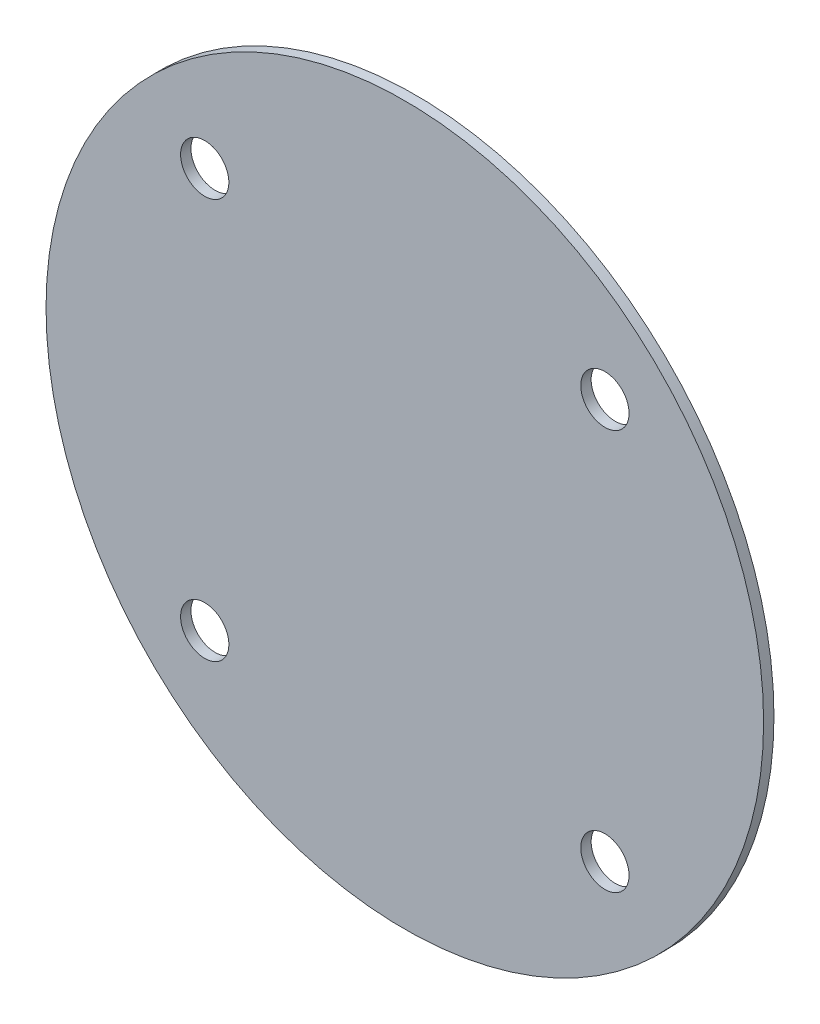
ISO-10303-21;
HEADER;
FILE_DESCRIPTION(('STEP AP214'),'2;1');
FILE_NAME('part.step','',(''),(''),'','','');
FILE_SCHEMA(('AUTOMOTIVE_DESIGN { 1 0 10303 214 1 1 1 1 }'));
ENDSEC;
DATA;
#1=APPLICATION_CONTEXT('core data for automotive mechanical design processes');
#2=APPLICATION_PROTOCOL_DEFINITION('international standard','automotive_design',2000,#1);
#3=PRODUCT_CONTEXT('',#1,'mechanical');
#4=PRODUCT('Part','Part','',(#3));
#5=PRODUCT_RELATED_PRODUCT_CATEGORY('part','',(#4));
#6=PRODUCT_DEFINITION_FORMATION('','',#4);
#7=PRODUCT_DEFINITION_CONTEXT('part definition',#1,'design');
#8=PRODUCT_DEFINITION('design','',#6,#7);
#9=PRODUCT_DEFINITION_SHAPE('','',#8);
#10=(LENGTH_UNIT() NAMED_UNIT(*) SI_UNIT(.MILLI.,.METRE.));
#11=(NAMED_UNIT(*) PLANE_ANGLE_UNIT() SI_UNIT($,.RADIAN.));
#12=(NAMED_UNIT(*) SI_UNIT($,.STERADIAN.) SOLID_ANGLE_UNIT());
#13=UNCERTAINTY_MEASURE_WITH_UNIT(LENGTH_MEASURE(1.E-05),#10,'distance_accuracy_value','');
#14=(GEOMETRIC_REPRESENTATION_CONTEXT(3) GLOBAL_UNCERTAINTY_ASSIGNED_CONTEXT((#13)) GLOBAL_UNIT_ASSIGNED_CONTEXT((#10,
#11,#12)) REPRESENTATION_CONTEXT('',''));
#15=CARTESIAN_POINT('',(0.,0.,0.));
#16=DIRECTION('',(0.,0.,1.));
#17=DIRECTION('',(1.,0.,0.));
#18=AXIS2_PLACEMENT_3D('',#15,#16,#17);
#19=CARTESIAN_POINT('',(29.,29.,17.));
#20=DIRECTION('',(0.,0.,1.));
#21=DIRECTION('',(1.,0.,0.));
#22=AXIS2_PLACEMENT_3D('',#19,#20,#21);
#23=CYLINDRICAL_SURFACE('',#22,3.5);
#24=DIRECTION('',(0.,0.,1.));
#25=VECTOR('',#24,1.);
#26=CARTESIAN_POINT('',(32.5,29.,17.));
#27=LINE('',#26,#25);
#28=CARTESIAN_POINT('',(32.5,29.,18.));
#29=VERTEX_POINT('',#28);
#30=CARTESIAN_POINT('',(32.5,29.,19.5));
#31=VERTEX_POINT('',#30);
#32=EDGE_CURVE('E10',#29,#31,#27,.T.);
#33=ORIENTED_EDGE('',*,*,#32,.F.);
#34=CARTESIAN_POINT('',(29.,29.,18.));
#35=DIRECTION('',(0.,0.,1.));
#36=DIRECTION('',(1.,0.,0.));
#37=AXIS2_PLACEMENT_3D('',#34,#35,#36);
#38=CIRCLE('',#37,3.5);
#39=EDGE_CURVE('E110',#29,#29,#38,.T.);
#40=ORIENTED_EDGE('',*,*,#39,.F.);
#41=ORIENTED_EDGE('',*,*,#32,.T.);
#42=CARTESIAN_POINT('',(29.,29.,19.5));
#43=DIRECTION('',(0.,0.,1.));
#44=DIRECTION('',(1.,0.,0.));
#45=AXIS2_PLACEMENT_3D('',#42,#43,#44);
#46=CIRCLE('',#45,3.5);
#47=EDGE_CURVE('E99',#31,#31,#46,.T.);
#48=ORIENTED_EDGE('',*,*,#47,.T.);
#49=EDGE_LOOP('',(#33,#40,#41,#48));
#50=FACE_BOUND('',#49,.T.);
#51=ADVANCED_FACE('F16',(#50),#23,.F.);
#52=CARTESIAN_POINT('',(-29.,29.,17.));
#53=DIRECTION('',(0.,0.,1.));
#54=DIRECTION('',(1.,0.,0.));
#55=AXIS2_PLACEMENT_3D('',#52,#53,#54);
#56=CYLINDRICAL_SURFACE('',#55,3.5);
#57=DIRECTION('',(0.,0.,1.));
#58=VECTOR('',#57,1.);
#59=CARTESIAN_POINT('',(-25.5,29.,17.));
#60=LINE('',#59,#58);
#61=CARTESIAN_POINT('',(-25.5,29.,18.));
#62=VERTEX_POINT('',#61);
#63=CARTESIAN_POINT('',(-25.5,29.,19.5));
#64=VERTEX_POINT('',#63);
#65=EDGE_CURVE('E27',#62,#64,#60,.T.);
#66=ORIENTED_EDGE('',*,*,#65,.F.);
#67=CARTESIAN_POINT('',(-29.,29.,18.));
#68=DIRECTION('',(0.,0.,1.));
#69=DIRECTION('',(1.,0.,0.));
#70=AXIS2_PLACEMENT_3D('',#67,#68,#69);
#71=CIRCLE('',#70,3.5);
#72=EDGE_CURVE('E78',#62,#62,#71,.T.);
#73=ORIENTED_EDGE('',*,*,#72,.F.);
#74=ORIENTED_EDGE('',*,*,#65,.T.);
#75=CARTESIAN_POINT('',(-29.,29.,19.5));
#76=DIRECTION('',(0.,0.,1.));
#77=DIRECTION('',(1.,0.,0.));
#78=AXIS2_PLACEMENT_3D('',#75,#76,#77);
#79=CIRCLE('',#78,3.5);
#80=EDGE_CURVE('E76',#64,#64,#79,.T.);
#81=ORIENTED_EDGE('',*,*,#80,.T.);
#82=EDGE_LOOP('',(#66,#73,#74,#81));
#83=FACE_BOUND('',#82,.T.);
#84=ADVANCED_FACE('F74',(#83),#56,.F.);
#85=CARTESIAN_POINT('',(29.,-29.,17.));
#86=DIRECTION('',(0.,0.,1.));
#87=DIRECTION('',(1.,0.,0.));
#88=AXIS2_PLACEMENT_3D('',#85,#86,#87);
#89=CYLINDRICAL_SURFACE('',#88,3.5);
#90=DIRECTION('',(0.,0.,1.));
#91=VECTOR('',#90,1.);
#92=CARTESIAN_POINT('',(32.5,-29.,17.));
#93=LINE('',#92,#91);
#94=CARTESIAN_POINT('',(32.5,-29.,18.));
#95=VERTEX_POINT('',#94);
#96=CARTESIAN_POINT('',(32.5,-29.,19.5));
#97=VERTEX_POINT('',#96);
#98=EDGE_CURVE('E80',#95,#97,#93,.T.);
#99=ORIENTED_EDGE('',*,*,#98,.F.);
#100=CARTESIAN_POINT('',(29.,-29.,18.));
#101=DIRECTION('',(0.,0.,1.));
#102=DIRECTION('',(1.,0.,0.));
#103=AXIS2_PLACEMENT_3D('',#100,#101,#102);
#104=CIRCLE('',#103,3.5);
#105=EDGE_CURVE('E102',#95,#95,#104,.T.);
#106=ORIENTED_EDGE('',*,*,#105,.F.);
#107=ORIENTED_EDGE('',*,*,#98,.T.);
#108=CARTESIAN_POINT('',(29.,-29.,19.5));
#109=DIRECTION('',(0.,0.,1.));
#110=DIRECTION('',(1.,0.,0.));
#111=AXIS2_PLACEMENT_3D('',#108,#109,#110);
#112=CIRCLE('',#111,3.5);
#113=EDGE_CURVE('E91',#97,#97,#112,.T.);
#114=ORIENTED_EDGE('',*,*,#113,.T.);
#115=EDGE_LOOP('',(#99,#106,#107,#114));
#116=FACE_BOUND('',#115,.T.);
#117=ADVANCED_FACE('F170',(#116),#89,.F.);
#118=CARTESIAN_POINT('',(-29.,-29.,17.));
#119=DIRECTION('',(0.,0.,1.));
#120=DIRECTION('',(1.,0.,0.));
#121=AXIS2_PLACEMENT_3D('',#118,#119,#120);
#122=CYLINDRICAL_SURFACE('',#121,3.5);
#123=DIRECTION('',(0.,0.,1.));
#124=VECTOR('',#123,1.);
#125=CARTESIAN_POINT('',(-25.5,-29.,17.));
#126=LINE('',#125,#124);
#127=CARTESIAN_POINT('',(-25.5,-29.,18.));
#128=VERTEX_POINT('',#127);
#129=CARTESIAN_POINT('',(-25.5,-29.,19.5));
#130=VERTEX_POINT('',#129);
#131=EDGE_CURVE('E86',#128,#130,#126,.T.);
#132=ORIENTED_EDGE('',*,*,#131,.F.);
#133=CARTESIAN_POINT('',(-29.,-29.,18.));
#134=DIRECTION('',(0.,0.,1.));
#135=DIRECTION('',(1.,0.,0.));
#136=AXIS2_PLACEMENT_3D('',#133,#134,#135);
#137=CIRCLE('',#136,3.5);
#138=EDGE_CURVE('E101',#128,#128,#137,.T.);
#139=ORIENTED_EDGE('',*,*,#138,.F.);
#140=ORIENTED_EDGE('',*,*,#131,.T.);
#141=CARTESIAN_POINT('',(-29.,-29.,19.5));
#142=DIRECTION('',(0.,0.,1.));
#143=DIRECTION('',(1.,0.,0.));
#144=AXIS2_PLACEMENT_3D('',#141,#142,#143);
#145=CIRCLE('',#144,3.5);
#146=EDGE_CURVE('E93',#130,#130,#145,.T.);
#147=ORIENTED_EDGE('',*,*,#146,.T.);
#148=EDGE_LOOP('',(#132,#139,#140,#147));
#149=FACE_BOUND('',#148,.T.);
#150=ADVANCED_FACE('F18',(#149),#122,.F.);
#151=CARTESIAN_POINT('',(0.,0.,18.));
#152=DIRECTION('',(0.,0.,1.));
#153=DIRECTION('',(1.,0.,0.));
#154=AXIS2_PLACEMENT_3D('',#151,#152,#153);
#155=PLANE('',#154);
#156=ORIENTED_EDGE('',*,*,#39,.T.);
#157=EDGE_LOOP('',(#156));
#158=FACE_BOUND('',#157,.T.);
#159=ORIENTED_EDGE('',*,*,#72,.T.);
#160=EDGE_LOOP('',(#159));
#161=FACE_BOUND('',#160,.T.);
#162=ORIENTED_EDGE('',*,*,#105,.T.);
#163=EDGE_LOOP('',(#162));
#164=FACE_BOUND('',#163,.T.);
#165=ORIENTED_EDGE('',*,*,#138,.T.);
#166=EDGE_LOOP('',(#165));
#167=FACE_BOUND('',#166,.T.);
#168=CARTESIAN_POINT('',(0.,0.,18.));
#169=DIRECTION('',(0.,0.,1.));
#170=DIRECTION('',(1.,0.,0.));
#171=AXIS2_PLACEMENT_3D('',#168,#169,#170);
#172=CIRCLE('',#171,52.);
#173=CARTESIAN_POINT('',(52.,0.,18.));
#174=VERTEX_POINT('',#173);
#175=EDGE_CURVE('E98',#174,#174,#172,.T.);
#176=ORIENTED_EDGE('',*,*,#175,.F.);
#177=EDGE_LOOP('',(#176));
#178=FACE_BOUND('',#177,.T.);
#179=ADVANCED_FACE('F134',(#158,#161,#164,#167,#178),#155,.F.);
#180=CARTESIAN_POINT('',(0.,0.,19.5));
#181=DIRECTION('',(0.,0.,1.));
#182=DIRECTION('',(1.,0.,0.));
#183=AXIS2_PLACEMENT_3D('',#180,#181,#182);
#184=PLANE('',#183);
#185=ORIENTED_EDGE('',*,*,#47,.F.);
#186=EDGE_LOOP('',(#185));
#187=FACE_BOUND('',#186,.T.);
#188=ORIENTED_EDGE('',*,*,#80,.F.);
#189=EDGE_LOOP('',(#188));
#190=FACE_BOUND('',#189,.T.);
#191=ORIENTED_EDGE('',*,*,#113,.F.);
#192=EDGE_LOOP('',(#191));
#193=FACE_BOUND('',#192,.T.);
#194=ORIENTED_EDGE('',*,*,#146,.F.);
#195=EDGE_LOOP('',(#194));
#196=FACE_BOUND('',#195,.T.);
#197=CARTESIAN_POINT('',(0.,0.,19.5));
#198=DIRECTION('',(0.,0.,1.));
#199=DIRECTION('',(1.,0.,0.));
#200=AXIS2_PLACEMENT_3D('',#197,#198,#199);
#201=CIRCLE('',#200,52.);
#202=CARTESIAN_POINT('',(52.,0.,19.5));
#203=VERTEX_POINT('',#202);
#204=EDGE_CURVE('E20',#203,#203,#201,.T.);
#205=ORIENTED_EDGE('',*,*,#204,.T.);
#206=EDGE_LOOP('',(#205));
#207=FACE_BOUND('',#206,.T.);
#208=ADVANCED_FACE('F138',(#187,#190,#193,#196,#207),#184,.T.);
#209=CARTESIAN_POINT('',(0.,0.,18.));
#210=DIRECTION('',(0.,0.,1.));
#211=DIRECTION('',(1.,0.,0.));
#212=AXIS2_PLACEMENT_3D('',#209,#210,#211);
#213=CYLINDRICAL_SURFACE('',#212,52.);
#214=ORIENTED_EDGE('',*,*,#204,.F.);
#215=DIRECTION('',(0.,0.,1.));
#216=VECTOR('',#215,1.);
#217=CARTESIAN_POINT('',(52.,0.,18.));
#218=LINE('',#217,#216);
#219=EDGE_CURVE('E95',#174,#203,#218,.T.);
#220=ORIENTED_EDGE('',*,*,#219,.F.);
#221=ORIENTED_EDGE('',*,*,#175,.T.);
#222=ORIENTED_EDGE('',*,*,#219,.T.);
#223=EDGE_LOOP('',(#214,#220,#221,#222));
#224=FACE_BOUND('',#223,.T.);
#225=ADVANCED_FACE('F141',(#224),#213,.T.);
#226=CLOSED_SHELL('',(#51,#84,#117,#150,#179,#208,#225));
#227=MANIFOLD_SOLID_BREP('B1',#226);
#228=ADVANCED_BREP_SHAPE_REPRESENTATION('',(#18,#227),#14);
#229=SHAPE_DEFINITION_REPRESENTATION(#9,#228);
ENDSEC;
END-ISO-10303-21;
